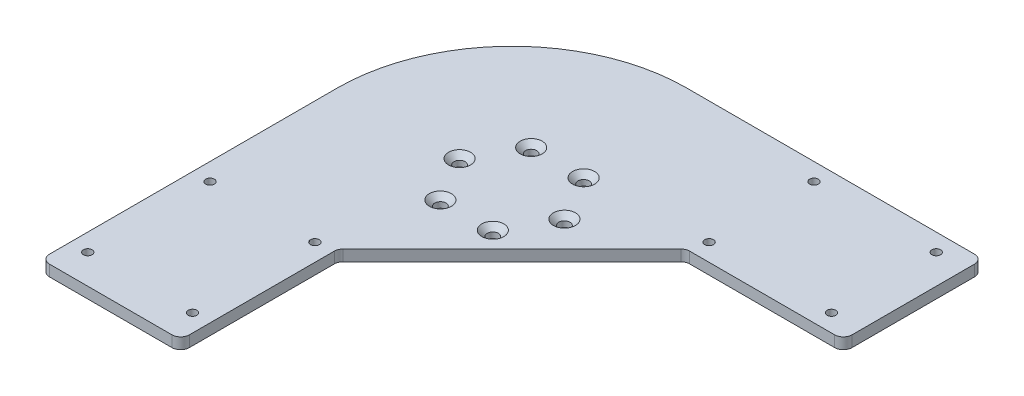
ISO-10303-21;
HEADER;
FILE_DESCRIPTION(('STEP AP214'),'2;1');
FILE_NAME('part.step','',(''),(''),'','','');
FILE_SCHEMA(('AUTOMOTIVE_DESIGN { 1 0 10303 214 1 1 1 1 }'));
ENDSEC;
DATA;
#1=APPLICATION_CONTEXT('core data for automotive mechanical design processes');
#2=APPLICATION_PROTOCOL_DEFINITION('international standard','automotive_design',2000,#1);
#3=PRODUCT_CONTEXT('',#1,'mechanical');
#4=PRODUCT('Part','Part','',(#3));
#5=PRODUCT_RELATED_PRODUCT_CATEGORY('part','',(#4));
#6=PRODUCT_DEFINITION_FORMATION('','',#4);
#7=PRODUCT_DEFINITION_CONTEXT('part definition',#1,'design');
#8=PRODUCT_DEFINITION('design','',#6,#7);
#9=PRODUCT_DEFINITION_SHAPE('','',#8);
#10=(LENGTH_UNIT() NAMED_UNIT(*) SI_UNIT(.MILLI.,.METRE.));
#11=(NAMED_UNIT(*) PLANE_ANGLE_UNIT() SI_UNIT($,.RADIAN.));
#12=(NAMED_UNIT(*) SI_UNIT($,.STERADIAN.) SOLID_ANGLE_UNIT());
#13=UNCERTAINTY_MEASURE_WITH_UNIT(LENGTH_MEASURE(1.E-05),#10,'distance_accuracy_value','');
#14=(GEOMETRIC_REPRESENTATION_CONTEXT(3) GLOBAL_UNCERTAINTY_ASSIGNED_CONTEXT((#13)) GLOBAL_UNIT_ASSIGNED_CONTEXT((#10,
#11,#12)) REPRESENTATION_CONTEXT('',''));
#15=CARTESIAN_POINT('',(0.,0.,0.));
#16=DIRECTION('',(0.,0.,1.));
#17=DIRECTION('',(1.,0.,0.));
#18=AXIS2_PLACEMENT_3D('',#15,#16,#17);
#19=CARTESIAN_POINT('',(169.625,-6.35,-100.));
#20=DIRECTION('',(1.,0.,0.));
#21=DIRECTION('',(0.,0.,-1.));
#22=AXIS2_PLACEMENT_3D('',#19,#20,#21);
#23=PLANE('',#22);
#24=DIRECTION('',(0.,0.,-1.));
#25=VECTOR('',#24,1.);
#26=CARTESIAN_POINT('',(169.625,-6.35,-100.));
#27=LINE('',#26,#25);
#28=CARTESIAN_POINT('',(169.625,-6.35,-25.));
#29=VERTEX_POINT('',#28);
#30=CARTESIAN_POINT('',(169.625,-6.35,-95.));
#31=VERTEX_POINT('',#30);
#32=EDGE_CURVE('E154',#29,#31,#27,.T.);
#33=ORIENTED_EDGE('',*,*,#32,.T.);
#34=DIRECTION('',(0.,1.,0.));
#35=VECTOR('',#34,1.);
#36=CARTESIAN_POINT('',(169.625,-6.35,-95.));
#37=LINE('',#36,#35);
#38=CARTESIAN_POINT('',(169.625,0.,-95.));
#39=VERTEX_POINT('',#38);
#40=EDGE_CURVE('E222',#31,#39,#37,.T.);
#41=ORIENTED_EDGE('',*,*,#40,.T.);
#42=DIRECTION('',(0.,0.,-1.));
#43=VECTOR('',#42,1.);
#44=CARTESIAN_POINT('',(169.625,0.,-100.));
#45=LINE('',#44,#43);
#46=CARTESIAN_POINT('',(169.625,0.,-25.));
#47=VERTEX_POINT('',#46);
#48=EDGE_CURVE('E187',#47,#39,#45,.T.);
#49=ORIENTED_EDGE('',*,*,#48,.F.);
#50=DIRECTION('',(0.,1.,0.));
#51=VECTOR('',#50,1.);
#52=CARTESIAN_POINT('',(169.625,-6.35,-25.));
#53=LINE('',#52,#51);
#54=EDGE_CURVE('E218',#47,#29,#53,.F.);
#55=ORIENTED_EDGE('',*,*,#54,.T.);
#56=EDGE_LOOP('',(#33,#41,#49,#55));
#57=FACE_BOUND('',#56,.T.);
#58=ADVANCED_FACE('F39',(#57),#23,.T.);
#59=CARTESIAN_POINT('',(169.625,-6.35,-20.));
#60=DIRECTION('',(0.,0.,1.));
#61=DIRECTION('',(1.,0.,0.));
#62=AXIS2_PLACEMENT_3D('',#59,#60,#61);
#63=PLANE('',#62);
#64=DIRECTION('',(1.,0.,0.));
#65=VECTOR('',#64,1.);
#66=CARTESIAN_POINT('',(169.625,-6.35,-20.));
#67=LINE('',#66,#65);
#68=CARTESIAN_POINT('',(81.6960678118655,-6.35,-20.));
#69=VERTEX_POINT('',#68);
#70=CARTESIAN_POINT('',(164.625,-6.35,-20.));
#71=VERTEX_POINT('',#70);
#72=EDGE_CURVE('E163',#69,#71,#67,.T.);
#73=ORIENTED_EDGE('',*,*,#72,.T.);
#74=DIRECTION('',(0.,1.,0.));
#75=VECTOR('',#74,1.);
#76=CARTESIAN_POINT('',(164.625,-6.35,-20.));
#77=LINE('',#76,#75);
#78=CARTESIAN_POINT('',(164.625,0.,-20.));
#79=VERTEX_POINT('',#78);
#80=EDGE_CURVE('E253',#71,#79,#77,.T.);
#81=ORIENTED_EDGE('',*,*,#80,.T.);
#82=DIRECTION('',(1.,0.,0.));
#83=VECTOR('',#82,1.);
#84=CARTESIAN_POINT('',(169.625,0.,-20.));
#85=LINE('',#84,#83);
#86=CARTESIAN_POINT('',(81.6960678118655,0.,-20.));
#87=VERTEX_POINT('',#86);
#88=EDGE_CURVE('E213',#87,#79,#85,.T.);
#89=ORIENTED_EDGE('',*,*,#88,.F.);
#90=DIRECTION('',(0.,1.,0.));
#91=VECTOR('',#90,1.);
#92=CARTESIAN_POINT('',(81.6960678118655,-6.35,-20.));
#93=LINE('',#92,#91);
#94=EDGE_CURVE('E250',#87,#69,#93,.F.);
#95=ORIENTED_EDGE('',*,*,#94,.T.);
#96=EDGE_LOOP('',(#73,#81,#89,#95));
#97=FACE_BOUND('',#96,.T.);
#98=ADVANCED_FACE('F509',(#97),#63,.T.);
#99=CARTESIAN_POINT('',(-20.,-6.35,79.625));
#100=DIRECTION('',(0.707106781186547,0.,0.707106781186548));
#101=DIRECTION('',(0.707106781186548,0.,-0.707106781186547));
#102=AXIS2_PLACEMENT_3D('',#99,#100,#101);
#103=PLANE('',#102);
#104=DIRECTION('',(0.707106781186548,0.,-0.707106781186548));
#105=VECTOR('',#104,1.);
#106=CARTESIAN_POINT('',(-20.,-6.35,79.625));
#107=LINE('',#106,#105);
#108=CARTESIAN_POINT('',(-18.5355339059327,-6.35,78.1605339059328));
#109=VERTEX_POINT('',#108);
#110=CARTESIAN_POINT('',(78.1605339059328,-6.35,-18.5355339059327));
#111=VERTEX_POINT('',#110);
#112=EDGE_CURVE('E180',#109,#111,#107,.T.);
#113=ORIENTED_EDGE('',*,*,#112,.T.);
#114=DIRECTION('',(0.,1.,0.));
#115=VECTOR('',#114,1.);
#116=CARTESIAN_POINT('',(78.1605339059328,0.,-18.5355339059327));
#117=LINE('',#116,#115);
#118=CARTESIAN_POINT('',(78.1605339059328,0.,-18.5355339059327));
#119=VERTEX_POINT('',#118);
#120=EDGE_CURVE('E260',#111,#119,#117,.T.);
#121=ORIENTED_EDGE('',*,*,#120,.T.);
#122=DIRECTION('',(0.707106781186548,0.,-0.707106781186548));
#123=VECTOR('',#122,1.);
#124=CARTESIAN_POINT('',(-20.,0.,79.625));
#125=LINE('',#124,#123);
#126=CARTESIAN_POINT('',(-18.5355339059327,0.,78.1605339059328));
#127=VERTEX_POINT('',#126);
#128=EDGE_CURVE('E209',#127,#119,#125,.T.);
#129=ORIENTED_EDGE('',*,*,#128,.F.);
#130=DIRECTION('',(0.,1.,0.));
#131=VECTOR('',#130,1.);
#132=CARTESIAN_POINT('',(-18.5355339059327,-6.35,78.1605339059328));
#133=LINE('',#132,#131);
#134=EDGE_CURVE('E257',#127,#109,#133,.F.);
#135=ORIENTED_EDGE('',*,*,#134,.T.);
#136=EDGE_LOOP('',(#113,#121,#129,#135));
#137=FACE_BOUND('',#136,.T.);
#138=ADVANCED_FACE('F296',(#137),#103,.T.);
#139=CARTESIAN_POINT('',(-20.,-6.35,79.625));
#140=DIRECTION('',(1.,0.,0.));
#141=DIRECTION('',(0.,0.,-1.));
#142=AXIS2_PLACEMENT_3D('',#139,#140,#141);
#143=PLANE('',#142);
#144=DIRECTION('',(0.,0.,-1.));
#145=VECTOR('',#144,1.);
#146=CARTESIAN_POINT('',(-20.,-6.35,79.625));
#147=LINE('',#146,#145);
#148=CARTESIAN_POINT('',(-20.,-6.35,164.625));
#149=VERTEX_POINT('',#148);
#150=CARTESIAN_POINT('',(-20.,-6.35,81.6960678118655));
#151=VERTEX_POINT('',#150);
#152=EDGE_CURVE('E176',#149,#151,#147,.T.);
#153=ORIENTED_EDGE('',*,*,#152,.T.);
#154=DIRECTION('',(0.,1.,0.));
#155=VECTOR('',#154,1.);
#156=CARTESIAN_POINT('',(-20.,0.,81.6960678118655));
#157=LINE('',#156,#155);
#158=CARTESIAN_POINT('',(-20.,0.,81.6960678118655));
#159=VERTEX_POINT('',#158);
#160=EDGE_CURVE('E267',#151,#159,#157,.T.);
#161=ORIENTED_EDGE('',*,*,#160,.T.);
#162=DIRECTION('',(0.,0.,-1.));
#163=VECTOR('',#162,1.);
#164=CARTESIAN_POINT('',(-20.,0.,79.625));
#165=LINE('',#164,#163);
#166=CARTESIAN_POINT('',(-20.,0.,164.625));
#167=VERTEX_POINT('',#166);
#168=EDGE_CURVE('E205',#167,#159,#165,.T.);
#169=ORIENTED_EDGE('',*,*,#168,.F.);
#170=DIRECTION('',(0.,1.,0.));
#171=VECTOR('',#170,1.);
#172=CARTESIAN_POINT('',(-20.,-6.35,164.625));
#173=LINE('',#172,#171);
#174=EDGE_CURVE('E264',#167,#149,#173,.F.);
#175=ORIENTED_EDGE('',*,*,#174,.T.);
#176=EDGE_LOOP('',(#153,#161,#169,#175));
#177=FACE_BOUND('',#176,.T.);
#178=ADVANCED_FACE('F302',(#177),#143,.T.);
#179=CARTESIAN_POINT('',(-20.,-6.35,169.625));
#180=DIRECTION('',(0.,0.,1.));
#181=DIRECTION('',(1.,0.,0.));
#182=AXIS2_PLACEMENT_3D('',#179,#180,#181);
#183=PLANE('',#182);
#184=DIRECTION('',(1.,0.,0.));
#185=VECTOR('',#184,1.);
#186=CARTESIAN_POINT('',(-20.,0.,169.625));
#187=LINE('',#186,#185);
#188=CARTESIAN_POINT('',(-95.,0.,169.625));
#189=VERTEX_POINT('',#188);
#190=CARTESIAN_POINT('',(-25.,0.,169.625));
#191=VERTEX_POINT('',#190);
#192=EDGE_CURVE('E201',#189,#191,#187,.T.);
#193=ORIENTED_EDGE('',*,*,#192,.F.);
#194=DIRECTION('',(0.,1.,0.));
#195=VECTOR('',#194,1.);
#196=CARTESIAN_POINT('',(-95.,-6.35,169.625));
#197=LINE('',#196,#195);
#198=CARTESIAN_POINT('',(-95.,-6.35,169.625));
#199=VERTEX_POINT('',#198);
#200=EDGE_CURVE('E279',#189,#199,#197,.F.);
#201=ORIENTED_EDGE('',*,*,#200,.T.);
#202=DIRECTION('',(1.,0.,0.));
#203=VECTOR('',#202,1.);
#204=CARTESIAN_POINT('',(-20.,-6.35,169.625));
#205=LINE('',#204,#203);
#206=CARTESIAN_POINT('',(-25.,-6.35,169.625));
#207=VERTEX_POINT('',#206);
#208=EDGE_CURVE('E170',#199,#207,#205,.T.);
#209=ORIENTED_EDGE('',*,*,#208,.T.);
#210=DIRECTION('',(0.,1.,0.));
#211=VECTOR('',#210,1.);
#212=CARTESIAN_POINT('',(-25.,-6.35,169.625));
#213=LINE('',#212,#211);
#214=EDGE_CURVE('E275',#207,#191,#213,.T.);
#215=ORIENTED_EDGE('',*,*,#214,.T.);
#216=EDGE_LOOP('',(#193,#201,#209,#215));
#217=FACE_BOUND('',#216,.T.);
#218=ADVANCED_FACE('F308',(#217),#183,.T.);
#219=CARTESIAN_POINT('',(-100.,-6.35,169.625));
#220=DIRECTION('',(-1.,0.,0.));
#221=DIRECTION('',(0.,0.,1.));
#222=AXIS2_PLACEMENT_3D('',#219,#220,#221);
#223=PLANE('',#222);
#224=DIRECTION('',(0.,0.,1.));
#225=VECTOR('',#224,1.);
#226=CARTESIAN_POINT('',(-100.,-6.35,169.625));
#227=LINE('',#226,#225);
#228=CARTESIAN_POINT('',(-100.,-6.35,0.));
#229=VERTEX_POINT('',#228);
#230=CARTESIAN_POINT('',(-100.,-6.35,164.625));
#231=VERTEX_POINT('',#230);
#232=EDGE_CURVE('E166',#229,#231,#227,.T.);
#233=ORIENTED_EDGE('',*,*,#232,.T.);
#234=DIRECTION('',(0.,1.,0.));
#235=VECTOR('',#234,1.);
#236=CARTESIAN_POINT('',(-100.,-6.35,164.625));
#237=LINE('',#236,#235);
#238=CARTESIAN_POINT('',(-100.,0.,164.625));
#239=VERTEX_POINT('',#238);
#240=EDGE_CURVE('E271',#231,#239,#237,.T.);
#241=ORIENTED_EDGE('',*,*,#240,.T.);
#242=DIRECTION('',(0.,0.,1.));
#243=VECTOR('',#242,1.);
#244=CARTESIAN_POINT('',(-100.,0.,169.625));
#245=LINE('',#244,#243);
#246=CARTESIAN_POINT('',(-100.,0.,0.));
#247=VERTEX_POINT('',#246);
#248=EDGE_CURVE('E197',#247,#239,#245,.T.);
#249=ORIENTED_EDGE('',*,*,#248,.F.);
#250=DIRECTION('',(0.,1.,0.));
#251=VECTOR('',#250,1.);
#252=CARTESIAN_POINT('',(-100.,-6.35,0.));
#253=LINE('',#252,#251);
#254=EDGE_CURVE('E162',#229,#247,#253,.T.);
#255=ORIENTED_EDGE('',*,*,#254,.F.);
#256=EDGE_LOOP('',(#233,#241,#249,#255));
#257=FACE_BOUND('',#256,.T.);
#258=ADVANCED_FACE('F315',(#257),#223,.T.);
#259=CARTESIAN_POINT('',(0.,-6.35,0.));
#260=DIRECTION('',(0.,1.,0.));
#261=DIRECTION('',(0.,0.,1.));
#262=AXIS2_PLACEMENT_3D('',#259,#260,#261);
#263=CYLINDRICAL_SURFACE('',#262,100.);
#264=CARTESIAN_POINT('',(0.,0.,0.));
#265=DIRECTION('',(0.,1.,0.));
#266=DIRECTION('',(0.,0.,1.));
#267=AXIS2_PLACEMENT_3D('',#264,#265,#266);
#268=CIRCLE('',#267,100.);
#269=CARTESIAN_POINT('',(0.,0.,-100.));
#270=VERTEX_POINT('',#269);
#271=EDGE_CURVE('E160',#270,#247,#268,.T.);
#272=ORIENTED_EDGE('',*,*,#271,.F.);
#273=DIRECTION('',(0.,1.,0.));
#274=VECTOR('',#273,1.);
#275=CARTESIAN_POINT('',(0.,-6.35,-100.));
#276=LINE('',#275,#274);
#277=CARTESIAN_POINT('',(0.,-6.35,-100.));
#278=VERTEX_POINT('',#277);
#279=EDGE_CURVE('E146',#278,#270,#276,.T.);
#280=ORIENTED_EDGE('',*,*,#279,.F.);
#281=CARTESIAN_POINT('',(0.,-6.35,0.));
#282=DIRECTION('',(0.,1.,0.));
#283=DIRECTION('',(0.,0.,1.));
#284=AXIS2_PLACEMENT_3D('',#281,#282,#283);
#285=CIRCLE('',#284,100.);
#286=EDGE_CURVE('E153',#278,#229,#285,.T.);
#287=ORIENTED_EDGE('',*,*,#286,.T.);
#288=ORIENTED_EDGE('',*,*,#254,.T.);
#289=EDGE_LOOP('',(#272,#280,#287,#288));
#290=FACE_BOUND('',#289,.T.);
#291=ADVANCED_FACE('F158',(#290),#263,.T.);
#292=CARTESIAN_POINT('',(0.,-6.35,-100.));
#293=DIRECTION('',(0.,0.,-1.));
#294=DIRECTION('',(-1.,0.,0.));
#295=AXIS2_PLACEMENT_3D('',#292,#293,#294);
#296=PLANE('',#295);
#297=DIRECTION('',(-1.,0.,0.));
#298=VECTOR('',#297,1.);
#299=CARTESIAN_POINT('',(0.,0.,-100.));
#300=LINE('',#299,#298);
#301=CARTESIAN_POINT('',(164.625,0.,-100.));
#302=VERTEX_POINT('',#301);
#303=EDGE_CURVE('E191',#302,#270,#300,.T.);
#304=ORIENTED_EDGE('',*,*,#303,.F.);
#305=DIRECTION('',(0.,1.,0.));
#306=VECTOR('',#305,1.);
#307=CARTESIAN_POINT('',(164.625,-6.35,-100.));
#308=LINE('',#307,#306);
#309=CARTESIAN_POINT('',(164.625,-6.35,-100.));
#310=VERTEX_POINT('',#309);
#311=EDGE_CURVE('E149',#302,#310,#308,.F.);
#312=ORIENTED_EDGE('',*,*,#311,.T.);
#313=DIRECTION('',(-1.,0.,0.));
#314=VECTOR('',#313,1.);
#315=CARTESIAN_POINT('',(0.,-6.35,-100.));
#316=LINE('',#315,#314);
#317=EDGE_CURVE('E142',#310,#278,#316,.T.);
#318=ORIENTED_EDGE('',*,*,#317,.T.);
#319=ORIENTED_EDGE('',*,*,#279,.T.);
#320=EDGE_LOOP('',(#304,#312,#318,#319));
#321=FACE_BOUND('',#320,.T.);
#322=ADVANCED_FACE('F145',(#321),#296,.T.);
#323=CARTESIAN_POINT('',(0.,-6.35,0.));
#324=DIRECTION('',(0.,1.,0.));
#325=DIRECTION('',(0.,0.,1.));
#326=AXIS2_PLACEMENT_3D('',#323,#324,#325);
#327=PLANE('',#326);
#328=CARTESIAN_POINT('',(15.,-6.35,-25.9807621135332));
#329=DIRECTION('',(0.,1.,0.));
#330=DIRECTION('',(0.,0.,1.));
#331=AXIS2_PLACEMENT_3D('',#328,#329,#330);
#332=CIRCLE('',#331,3.2);
#333=CARTESIAN_POINT('',(15.,-6.35,-22.7807621135332));
#334=VERTEX_POINT('',#333);
#335=EDGE_CURVE('E450',#334,#334,#332,.T.);
#336=ORIENTED_EDGE('',*,*,#335,.T.);
#337=EDGE_LOOP('',(#336));
#338=FACE_BOUND('',#337,.T.);
#339=CARTESIAN_POINT('',(30.,-6.35,0.));
#340=DIRECTION('',(0.,1.,0.));
#341=DIRECTION('',(0.,0.,1.));
#342=AXIS2_PLACEMENT_3D('',#339,#340,#341);
#343=CIRCLE('',#342,3.2);
#344=CARTESIAN_POINT('',(30.,-6.35,3.19999999999999));
#345=VERTEX_POINT('',#344);
#346=EDGE_CURVE('E438',#345,#345,#343,.T.);
#347=ORIENTED_EDGE('',*,*,#346,.T.);
#348=EDGE_LOOP('',(#347));
#349=FACE_BOUND('',#348,.T.);
#350=CARTESIAN_POINT('',(15.,-6.35,25.9807621135332));
#351=DIRECTION('',(0.,1.,0.));
#352=DIRECTION('',(0.,0.,1.));
#353=AXIS2_PLACEMENT_3D('',#350,#351,#352);
#354=CIRCLE('',#353,3.2);
#355=CARTESIAN_POINT('',(15.,-6.35,29.1807621135332));
#356=VERTEX_POINT('',#355);
#357=EDGE_CURVE('E426',#356,#356,#354,.T.);
#358=ORIENTED_EDGE('',*,*,#357,.T.);
#359=EDGE_LOOP('',(#358));
#360=FACE_BOUND('',#359,.T.);
#361=CARTESIAN_POINT('',(-15.,-6.35,25.9807621135332));
#362=DIRECTION('',(0.,1.,0.));
#363=DIRECTION('',(0.,0.,1.));
#364=AXIS2_PLACEMENT_3D('',#361,#362,#363);
#365=CIRCLE('',#364,3.2);
#366=CARTESIAN_POINT('',(-15.,-6.35,29.1807621135332));
#367=VERTEX_POINT('',#366);
#368=EDGE_CURVE('E414',#367,#367,#365,.T.);
#369=ORIENTED_EDGE('',*,*,#368,.T.);
#370=EDGE_LOOP('',(#369));
#371=FACE_BOUND('',#370,.T.);
#372=CARTESIAN_POINT('',(-30.,-6.35,0.));
#373=DIRECTION('',(0.,1.,0.));
#374=DIRECTION('',(0.,0.,1.));
#375=AXIS2_PLACEMENT_3D('',#372,#373,#374);
#376=CIRCLE('',#375,3.2);
#377=CARTESIAN_POINT('',(-30.,-6.35,3.2));
#378=VERTEX_POINT('',#377);
#379=EDGE_CURVE('E402',#378,#378,#376,.T.);
#380=ORIENTED_EDGE('',*,*,#379,.T.);
#381=EDGE_LOOP('',(#380));
#382=FACE_BOUND('',#381,.T.);
#383=CARTESIAN_POINT('',(-15.,-6.35,-25.9807621135332));
#384=DIRECTION('',(0.,1.,0.));
#385=DIRECTION('',(0.,0.,1.));
#386=AXIS2_PLACEMENT_3D('',#383,#384,#385);
#387=CIRCLE('',#386,3.2);
#388=CARTESIAN_POINT('',(-15.,-6.35,-22.7807621135332));
#389=VERTEX_POINT('',#388);
#390=EDGE_CURVE('E390',#389,#389,#387,.T.);
#391=ORIENTED_EDGE('',*,*,#390,.T.);
#392=EDGE_LOOP('',(#391));
#393=FACE_BOUND('',#392,.T.);
#394=CARTESIAN_POINT('',(82.8,-6.35,-90.));
#395=DIRECTION('',(0.,1.,0.));
#396=DIRECTION('',(0.,0.,1.));
#397=AXIS2_PLACEMENT_3D('',#394,#395,#396);
#398=CIRCLE('',#397,2.5);
#399=CARTESIAN_POINT('',(82.8,-6.35,-87.5));
#400=VERTEX_POINT('',#399);
#401=EDGE_CURVE('E382',#400,#400,#398,.T.);
#402=ORIENTED_EDGE('',*,*,#401,.T.);
#403=EDGE_LOOP('',(#402));
#404=FACE_BOUND('',#403,.T.);
#405=CARTESIAN_POINT('',(152.8,-6.35,-90.));
#406=DIRECTION('',(0.,1.,0.));
#407=DIRECTION('',(0.,0.,1.));
#408=AXIS2_PLACEMENT_3D('',#405,#406,#407);
#409=CIRCLE('',#408,2.5);
#410=CARTESIAN_POINT('',(152.8,-6.35,-87.5));
#411=VERTEX_POINT('',#410);
#412=EDGE_CURVE('E374',#411,#411,#409,.T.);
#413=ORIENTED_EDGE('',*,*,#412,.T.);
#414=EDGE_LOOP('',(#413));
#415=FACE_BOUND('',#414,.T.);
#416=CARTESIAN_POINT('',(152.8,-6.35,-30.));
#417=DIRECTION('',(0.,1.,0.));
#418=DIRECTION('',(0.,0.,1.));
#419=AXIS2_PLACEMENT_3D('',#416,#417,#418);
#420=CIRCLE('',#419,2.5);
#421=CARTESIAN_POINT('',(152.8,-6.35,-27.5));
#422=VERTEX_POINT('',#421);
#423=EDGE_CURVE('E366',#422,#422,#420,.T.);
#424=ORIENTED_EDGE('',*,*,#423,.T.);
#425=EDGE_LOOP('',(#424));
#426=FACE_BOUND('',#425,.T.);
#427=CARTESIAN_POINT('',(-90.,-6.35,82.8));
#428=DIRECTION('',(0.,1.,0.));
#429=DIRECTION('',(0.,0.,1.));
#430=AXIS2_PLACEMENT_3D('',#427,#428,#429);
#431=CIRCLE('',#430,2.5);
#432=CARTESIAN_POINT('',(-90.,-6.35,85.3));
#433=VERTEX_POINT('',#432);
#434=EDGE_CURVE('E358',#433,#433,#431,.T.);
#435=ORIENTED_EDGE('',*,*,#434,.T.);
#436=EDGE_LOOP('',(#435));
#437=FACE_BOUND('',#436,.T.);
#438=CARTESIAN_POINT('',(-30.,-6.35,82.8));
#439=DIRECTION('',(0.,1.,0.));
#440=DIRECTION('',(0.,0.,1.));
#441=AXIS2_PLACEMENT_3D('',#438,#439,#440);
#442=CIRCLE('',#441,2.5);
#443=CARTESIAN_POINT('',(-30.,-6.35,85.3));
#444=VERTEX_POINT('',#443);
#445=EDGE_CURVE('E350',#444,#444,#442,.T.);
#446=ORIENTED_EDGE('',*,*,#445,.T.);
#447=EDGE_LOOP('',(#446));
#448=FACE_BOUND('',#447,.T.);
#449=CARTESIAN_POINT('',(-30.,-6.35,152.8));
#450=DIRECTION('',(0.,1.,0.));
#451=DIRECTION('',(0.,0.,1.));
#452=AXIS2_PLACEMENT_3D('',#449,#450,#451);
#453=CIRCLE('',#452,2.5);
#454=CARTESIAN_POINT('',(-30.,-6.35,155.3));
#455=VERTEX_POINT('',#454);
#456=EDGE_CURVE('E342',#455,#455,#453,.T.);
#457=ORIENTED_EDGE('',*,*,#456,.T.);
#458=EDGE_LOOP('',(#457));
#459=FACE_BOUND('',#458,.T.);
#460=CARTESIAN_POINT('',(-90.,-6.35,152.8));
#461=DIRECTION('',(0.,1.,0.));
#462=DIRECTION('',(0.,0.,1.));
#463=AXIS2_PLACEMENT_3D('',#460,#461,#462);
#464=CIRCLE('',#463,2.5);
#465=CARTESIAN_POINT('',(-90.,-6.35,155.3));
#466=VERTEX_POINT('',#465);
#467=EDGE_CURVE('E334',#466,#466,#464,.T.);
#468=ORIENTED_EDGE('',*,*,#467,.T.);
#469=EDGE_LOOP('',(#468));
#470=FACE_BOUND('',#469,.T.);
#471=CARTESIAN_POINT('',(82.8,-6.35,-30.));
#472=DIRECTION('',(0.,1.,0.));
#473=DIRECTION('',(0.,0.,1.));
#474=AXIS2_PLACEMENT_3D('',#471,#472,#473);
#475=CIRCLE('',#474,2.5);
#476=CARTESIAN_POINT('',(82.8,-6.35,-27.5));
#477=VERTEX_POINT('',#476);
#478=EDGE_CURVE('E192',#477,#477,#475,.T.);
#479=ORIENTED_EDGE('',*,*,#478,.T.);
#480=EDGE_LOOP('',(#479));
#481=FACE_BOUND('',#480,.T.);
#482=ORIENTED_EDGE('',*,*,#317,.F.);
#483=CARTESIAN_POINT('',(164.625,-6.35,-95.));
#484=DIRECTION('',(0.,1.,0.));
#485=DIRECTION('',(0.,0.,1.));
#486=AXIS2_PLACEMENT_3D('',#483,#484,#485);
#487=CIRCLE('',#486,5.);
#488=EDGE_CURVE('E247',#310,#31,#487,.F.);
#489=ORIENTED_EDGE('',*,*,#488,.T.);
#490=ORIENTED_EDGE('',*,*,#32,.F.);
#491=CARTESIAN_POINT('',(164.625,-6.35,-25.));
#492=DIRECTION('',(0.,1.,0.));
#493=DIRECTION('',(0.,0.,1.));
#494=AXIS2_PLACEMENT_3D('',#491,#492,#493);
#495=CIRCLE('',#494,5.);
#496=EDGE_CURVE('E244',#29,#71,#495,.F.);
#497=ORIENTED_EDGE('',*,*,#496,.T.);
#498=ORIENTED_EDGE('',*,*,#72,.F.);
#499=CARTESIAN_POINT('',(81.6960678118655,-6.35,-14.9999999999999));
#500=DIRECTION('',(0.,1.,0.));
#501=DIRECTION('',(0.,0.,1.));
#502=AXIS2_PLACEMENT_3D('',#499,#500,#501);
#503=CIRCLE('',#502,5.);
#504=EDGE_CURVE('E285',#69,#111,#503,.T.);
#505=ORIENTED_EDGE('',*,*,#504,.T.);
#506=ORIENTED_EDGE('',*,*,#112,.F.);
#507=CARTESIAN_POINT('',(-15.,-6.35,81.6960678118655));
#508=DIRECTION('',(0.,1.,0.));
#509=DIRECTION('',(0.,0.,1.));
#510=AXIS2_PLACEMENT_3D('',#507,#508,#509);
#511=CIRCLE('',#510,5.);
#512=EDGE_CURVE('E11',#109,#151,#511,.T.);
#513=ORIENTED_EDGE('',*,*,#512,.T.);
#514=ORIENTED_EDGE('',*,*,#152,.F.);
#515=CARTESIAN_POINT('',(-25.,-6.35,164.625));
#516=DIRECTION('',(0.,1.,0.));
#517=DIRECTION('',(0.,0.,1.));
#518=AXIS2_PLACEMENT_3D('',#515,#516,#517);
#519=CIRCLE('',#518,5.);
#520=EDGE_CURVE('E61',#149,#207,#519,.F.);
#521=ORIENTED_EDGE('',*,*,#520,.T.);
#522=ORIENTED_EDGE('',*,*,#208,.F.);
#523=CARTESIAN_POINT('',(-95.,-6.35,164.625));
#524=DIRECTION('',(0.,1.,0.));
#525=DIRECTION('',(0.,0.,1.));
#526=AXIS2_PLACEMENT_3D('',#523,#524,#525);
#527=CIRCLE('',#526,5.);
#528=EDGE_CURVE('E55',#199,#231,#527,.F.);
#529=ORIENTED_EDGE('',*,*,#528,.T.);
#530=ORIENTED_EDGE('',*,*,#232,.F.);
#531=ORIENTED_EDGE('',*,*,#286,.F.);
#532=EDGE_LOOP('',(#482,#489,#490,#497,#498,#505,#506,#513,#514,#521,#522,#529,#530,#531));
#533=FACE_BOUND('',#532,.T.);
#534=ADVANCED_FACE('F165',(#338,#349,#360,#371,#382,#393,#404,#415,#426,#437,#448,#459,#470,
#481,#533),#327,.F.);
#535=CARTESIAN_POINT('',(0.,0.,0.));
#536=DIRECTION('',(0.,1.,0.));
#537=DIRECTION('',(0.,0.,1.));
#538=AXIS2_PLACEMENT_3D('',#535,#536,#537);
#539=PLANE('',#538);
#540=CARTESIAN_POINT('',(15.,0.,-25.9807621135332));
#541=DIRECTION('',(0.,1.,0.));
#542=DIRECTION('',(0.,0.,1.));
#543=AXIS2_PLACEMENT_3D('',#540,#541,#542);
#544=CIRCLE('',#543,6.3);
#545=CARTESIAN_POINT('',(15.,0.,-19.6807621135332));
#546=VERTEX_POINT('',#545);
#547=EDGE_CURVE('E458',#546,#546,#544,.T.);
#548=ORIENTED_EDGE('',*,*,#547,.F.);
#549=EDGE_LOOP('',(#548));
#550=FACE_BOUND('',#549,.T.);
#551=CARTESIAN_POINT('',(30.,0.,0.));
#552=DIRECTION('',(0.,1.,0.));
#553=DIRECTION('',(0.,0.,1.));
#554=AXIS2_PLACEMENT_3D('',#551,#552,#553);
#555=CIRCLE('',#554,6.3);
#556=CARTESIAN_POINT('',(30.,0.,6.29999999999999));
#557=VERTEX_POINT('',#556);
#558=EDGE_CURVE('E446',#557,#557,#555,.T.);
#559=ORIENTED_EDGE('',*,*,#558,.F.);
#560=EDGE_LOOP('',(#559));
#561=FACE_BOUND('',#560,.T.);
#562=CARTESIAN_POINT('',(15.,0.,25.9807621135332));
#563=DIRECTION('',(0.,1.,0.));
#564=DIRECTION('',(0.,0.,1.));
#565=AXIS2_PLACEMENT_3D('',#562,#563,#564);
#566=CIRCLE('',#565,6.3);
#567=CARTESIAN_POINT('',(15.,0.,32.2807621135332));
#568=VERTEX_POINT('',#567);
#569=EDGE_CURVE('E434',#568,#568,#566,.T.);
#570=ORIENTED_EDGE('',*,*,#569,.F.);
#571=EDGE_LOOP('',(#570));
#572=FACE_BOUND('',#571,.T.);
#573=CARTESIAN_POINT('',(-15.,0.,25.9807621135332));
#574=DIRECTION('',(0.,1.,0.));
#575=DIRECTION('',(0.,0.,1.));
#576=AXIS2_PLACEMENT_3D('',#573,#574,#575);
#577=CIRCLE('',#576,6.3);
#578=CARTESIAN_POINT('',(-15.,0.,32.2807621135332));
#579=VERTEX_POINT('',#578);
#580=EDGE_CURVE('E422',#579,#579,#577,.T.);
#581=ORIENTED_EDGE('',*,*,#580,.F.);
#582=EDGE_LOOP('',(#581));
#583=FACE_BOUND('',#582,.T.);
#584=CARTESIAN_POINT('',(-30.,0.,0.));
#585=DIRECTION('',(0.,1.,0.));
#586=DIRECTION('',(0.,0.,1.));
#587=AXIS2_PLACEMENT_3D('',#584,#585,#586);
#588=CIRCLE('',#587,6.3);
#589=CARTESIAN_POINT('',(-30.,0.,6.3));
#590=VERTEX_POINT('',#589);
#591=EDGE_CURVE('E410',#590,#590,#588,.T.);
#592=ORIENTED_EDGE('',*,*,#591,.F.);
#593=EDGE_LOOP('',(#592));
#594=FACE_BOUND('',#593,.T.);
#595=CARTESIAN_POINT('',(-15.,0.,-25.9807621135332));
#596=DIRECTION('',(0.,1.,0.));
#597=DIRECTION('',(0.,0.,1.));
#598=AXIS2_PLACEMENT_3D('',#595,#596,#597);
#599=CIRCLE('',#598,6.3);
#600=CARTESIAN_POINT('',(-15.,0.,-19.6807621135332));
#601=VERTEX_POINT('',#600);
#602=EDGE_CURVE('E398',#601,#601,#599,.T.);
#603=ORIENTED_EDGE('',*,*,#602,.F.);
#604=EDGE_LOOP('',(#603));
#605=FACE_BOUND('',#604,.T.);
#606=CARTESIAN_POINT('',(82.8,0.,-90.));
#607=DIRECTION('',(0.,1.,0.));
#608=DIRECTION('',(0.,0.,1.));
#609=AXIS2_PLACEMENT_3D('',#606,#607,#608);
#610=CIRCLE('',#609,2.5);
#611=CARTESIAN_POINT('',(82.8,0.,-87.5));
#612=VERTEX_POINT('',#611);
#613=EDGE_CURVE('E386',#612,#612,#610,.T.);
#614=ORIENTED_EDGE('',*,*,#613,.F.);
#615=EDGE_LOOP('',(#614));
#616=FACE_BOUND('',#615,.T.);
#617=CARTESIAN_POINT('',(152.8,0.,-90.));
#618=DIRECTION('',(0.,1.,0.));
#619=DIRECTION('',(0.,0.,1.));
#620=AXIS2_PLACEMENT_3D('',#617,#618,#619);
#621=CIRCLE('',#620,2.5);
#622=CARTESIAN_POINT('',(152.8,0.,-87.5));
#623=VERTEX_POINT('',#622);
#624=EDGE_CURVE('E378',#623,#623,#621,.T.);
#625=ORIENTED_EDGE('',*,*,#624,.F.);
#626=EDGE_LOOP('',(#625));
#627=FACE_BOUND('',#626,.T.);
#628=CARTESIAN_POINT('',(152.8,0.,-30.));
#629=DIRECTION('',(0.,1.,0.));
#630=DIRECTION('',(0.,0.,1.));
#631=AXIS2_PLACEMENT_3D('',#628,#629,#630);
#632=CIRCLE('',#631,2.5);
#633=CARTESIAN_POINT('',(152.8,0.,-27.5));
#634=VERTEX_POINT('',#633);
#635=EDGE_CURVE('E370',#634,#634,#632,.T.);
#636=ORIENTED_EDGE('',*,*,#635,.F.);
#637=EDGE_LOOP('',(#636));
#638=FACE_BOUND('',#637,.T.);
#639=CARTESIAN_POINT('',(-90.,0.,82.8));
#640=DIRECTION('',(0.,1.,0.));
#641=DIRECTION('',(0.,0.,1.));
#642=AXIS2_PLACEMENT_3D('',#639,#640,#641);
#643=CIRCLE('',#642,2.5);
#644=CARTESIAN_POINT('',(-90.,0.,85.3));
#645=VERTEX_POINT('',#644);
#646=EDGE_CURVE('E362',#645,#645,#643,.T.);
#647=ORIENTED_EDGE('',*,*,#646,.F.);
#648=EDGE_LOOP('',(#647));
#649=FACE_BOUND('',#648,.T.);
#650=CARTESIAN_POINT('',(-30.,0.,82.8));
#651=DIRECTION('',(0.,1.,0.));
#652=DIRECTION('',(0.,0.,1.));
#653=AXIS2_PLACEMENT_3D('',#650,#651,#652);
#654=CIRCLE('',#653,2.5);
#655=CARTESIAN_POINT('',(-30.,0.,85.3));
#656=VERTEX_POINT('',#655);
#657=EDGE_CURVE('E354',#656,#656,#654,.T.);
#658=ORIENTED_EDGE('',*,*,#657,.F.);
#659=EDGE_LOOP('',(#658));
#660=FACE_BOUND('',#659,.T.);
#661=CARTESIAN_POINT('',(-30.,0.,152.8));
#662=DIRECTION('',(0.,1.,0.));
#663=DIRECTION('',(0.,0.,1.));
#664=AXIS2_PLACEMENT_3D('',#661,#662,#663);
#665=CIRCLE('',#664,2.5);
#666=CARTESIAN_POINT('',(-30.,0.,155.3));
#667=VERTEX_POINT('',#666);
#668=EDGE_CURVE('E346',#667,#667,#665,.T.);
#669=ORIENTED_EDGE('',*,*,#668,.F.);
#670=EDGE_LOOP('',(#669));
#671=FACE_BOUND('',#670,.T.);
#672=CARTESIAN_POINT('',(-90.,0.,152.8));
#673=DIRECTION('',(0.,1.,0.));
#674=DIRECTION('',(0.,0.,1.));
#675=AXIS2_PLACEMENT_3D('',#672,#673,#674);
#676=CIRCLE('',#675,2.5);
#677=CARTESIAN_POINT('',(-90.,0.,155.3));
#678=VERTEX_POINT('',#677);
#679=EDGE_CURVE('E338',#678,#678,#676,.T.);
#680=ORIENTED_EDGE('',*,*,#679,.F.);
#681=EDGE_LOOP('',(#680));
#682=FACE_BOUND('',#681,.T.);
#683=CARTESIAN_POINT('',(82.8,0.,-30.));
#684=DIRECTION('',(0.,1.,0.));
#685=DIRECTION('',(0.,0.,1.));
#686=AXIS2_PLACEMENT_3D('',#683,#684,#685);
#687=CIRCLE('',#686,2.5);
#688=CARTESIAN_POINT('',(82.8,0.,-27.5));
#689=VERTEX_POINT('',#688);
#690=EDGE_CURVE('E330',#689,#689,#687,.T.);
#691=ORIENTED_EDGE('',*,*,#690,.F.);
#692=EDGE_LOOP('',(#691));
#693=FACE_BOUND('',#692,.T.);
#694=ORIENTED_EDGE('',*,*,#48,.T.);
#695=CARTESIAN_POINT('',(164.625,0.,-95.));
#696=DIRECTION('',(0.,1.,0.));
#697=DIRECTION('',(0.,0.,1.));
#698=AXIS2_PLACEMENT_3D('',#695,#696,#697);
#699=CIRCLE('',#698,5.);
#700=EDGE_CURVE('E235',#39,#302,#699,.T.);
#701=ORIENTED_EDGE('',*,*,#700,.T.);
#702=ORIENTED_EDGE('',*,*,#303,.T.);
#703=ORIENTED_EDGE('',*,*,#271,.T.);
#704=ORIENTED_EDGE('',*,*,#248,.T.);
#705=CARTESIAN_POINT('',(-95.,0.,164.625));
#706=DIRECTION('',(0.,1.,0.));
#707=DIRECTION('',(0.,0.,1.));
#708=AXIS2_PLACEMENT_3D('',#705,#706,#707);
#709=CIRCLE('',#708,5.);
#710=EDGE_CURVE('E229',#239,#189,#709,.T.);
#711=ORIENTED_EDGE('',*,*,#710,.T.);
#712=ORIENTED_EDGE('',*,*,#192,.T.);
#713=CARTESIAN_POINT('',(-25.,0.,164.625));
#714=DIRECTION('',(0.,1.,0.));
#715=DIRECTION('',(0.,0.,1.));
#716=AXIS2_PLACEMENT_3D('',#713,#714,#715);
#717=CIRCLE('',#716,5.);
#718=EDGE_CURVE('E226',#191,#167,#717,.T.);
#719=ORIENTED_EDGE('',*,*,#718,.T.);
#720=ORIENTED_EDGE('',*,*,#168,.T.);
#721=CARTESIAN_POINT('',(-15.,0.,81.6960678118655));
#722=DIRECTION('',(0.,1.,0.));
#723=DIRECTION('',(0.,0.,1.));
#724=AXIS2_PLACEMENT_3D('',#721,#722,#723);
#725=CIRCLE('',#724,5.);
#726=EDGE_CURVE('E48',#159,#127,#725,.F.);
#727=ORIENTED_EDGE('',*,*,#726,.T.);
#728=ORIENTED_EDGE('',*,*,#128,.T.);
#729=CARTESIAN_POINT('',(81.6960678118655,0.,-14.9999999999999));
#730=DIRECTION('',(0.,1.,0.));
#731=DIRECTION('',(0.,0.,1.));
#732=AXIS2_PLACEMENT_3D('',#729,#730,#731);
#733=CIRCLE('',#732,5.);
#734=EDGE_CURVE('E282',#119,#87,#733,.F.);
#735=ORIENTED_EDGE('',*,*,#734,.T.);
#736=ORIENTED_EDGE('',*,*,#88,.T.);
#737=CARTESIAN_POINT('',(164.625,0.,-25.));
#738=DIRECTION('',(0.,1.,0.));
#739=DIRECTION('',(0.,0.,1.));
#740=AXIS2_PLACEMENT_3D('',#737,#738,#739);
#741=CIRCLE('',#740,5.);
#742=EDGE_CURVE('E232',#79,#47,#741,.T.);
#743=ORIENTED_EDGE('',*,*,#742,.T.);
#744=EDGE_LOOP('',(#694,#701,#702,#703,#704,#711,#712,#719,#720,#727,#728,#735,#736,#743));
#745=FACE_BOUND('',#744,.T.);
#746=ADVANCED_FACE('F290',(#550,#561,#572,#583,#594,#605,#616,#627,#638,#649,#660,#671,#682,
#693,#745),#539,.T.);
#747=CARTESIAN_POINT('',(164.625,-6.35,-95.));
#748=DIRECTION('',(0.,1.,0.));
#749=DIRECTION('',(0.,0.,1.));
#750=AXIS2_PLACEMENT_3D('',#747,#748,#749);
#751=CYLINDRICAL_SURFACE('',#750,5.);
#752=ORIENTED_EDGE('',*,*,#488,.F.);
#753=ORIENTED_EDGE('',*,*,#311,.F.);
#754=ORIENTED_EDGE('',*,*,#700,.F.);
#755=ORIENTED_EDGE('',*,*,#40,.F.);
#756=EDGE_LOOP('',(#752,#753,#754,#755));
#757=FACE_BOUND('',#756,.T.);
#758=ADVANCED_FACE('F317',(#757),#751,.T.);
#759=CARTESIAN_POINT('',(164.625,-6.35,-25.));
#760=DIRECTION('',(0.,1.,0.));
#761=DIRECTION('',(0.,0.,1.));
#762=AXIS2_PLACEMENT_3D('',#759,#760,#761);
#763=CYLINDRICAL_SURFACE('',#762,5.);
#764=ORIENTED_EDGE('',*,*,#496,.F.);
#765=ORIENTED_EDGE('',*,*,#54,.F.);
#766=ORIENTED_EDGE('',*,*,#742,.F.);
#767=ORIENTED_EDGE('',*,*,#80,.F.);
#768=EDGE_LOOP('',(#764,#765,#766,#767));
#769=FACE_BOUND('',#768,.T.);
#770=ADVANCED_FACE('F521',(#769),#763,.T.);
#771=CARTESIAN_POINT('',(81.6960678118655,-6.35,-14.9999999999999));
#772=DIRECTION('',(0.,-1.,0.));
#773=DIRECTION('',(0.,0.,-1.));
#774=AXIS2_PLACEMENT_3D('',#771,#772,#773);
#775=CYLINDRICAL_SURFACE('',#774,5.);
#776=ORIENTED_EDGE('',*,*,#504,.F.);
#777=ORIENTED_EDGE('',*,*,#94,.F.);
#778=ORIENTED_EDGE('',*,*,#734,.F.);
#779=ORIENTED_EDGE('',*,*,#120,.F.);
#780=EDGE_LOOP('',(#776,#777,#778,#779));
#781=FACE_BOUND('',#780,.T.);
#782=ADVANCED_FACE('F524',(#781),#775,.F.);
#783=CARTESIAN_POINT('',(-15.,-6.35,81.6960678118655));
#784=DIRECTION('',(0.,-1.,0.));
#785=DIRECTION('',(0.,0.,-1.));
#786=AXIS2_PLACEMENT_3D('',#783,#784,#785);
#787=CYLINDRICAL_SURFACE('',#786,5.);
#788=ORIENTED_EDGE('',*,*,#512,.F.);
#789=ORIENTED_EDGE('',*,*,#134,.F.);
#790=ORIENTED_EDGE('',*,*,#726,.F.);
#791=ORIENTED_EDGE('',*,*,#160,.F.);
#792=EDGE_LOOP('',(#788,#789,#790,#791));
#793=FACE_BOUND('',#792,.T.);
#794=ADVANCED_FACE('F300',(#793),#787,.F.);
#795=CARTESIAN_POINT('',(-95.,-6.35,164.625));
#796=DIRECTION('',(0.,1.,0.));
#797=DIRECTION('',(0.,0.,1.));
#798=AXIS2_PLACEMENT_3D('',#795,#796,#797);
#799=CYLINDRICAL_SURFACE('',#798,5.);
#800=ORIENTED_EDGE('',*,*,#528,.F.);
#801=ORIENTED_EDGE('',*,*,#200,.F.);
#802=ORIENTED_EDGE('',*,*,#710,.F.);
#803=ORIENTED_EDGE('',*,*,#240,.F.);
#804=EDGE_LOOP('',(#800,#801,#802,#803));
#805=FACE_BOUND('',#804,.T.);
#806=ADVANCED_FACE('F313',(#805),#799,.T.);
#807=CARTESIAN_POINT('',(-25.,-6.35,164.625));
#808=DIRECTION('',(0.,1.,0.));
#809=DIRECTION('',(0.,0.,1.));
#810=AXIS2_PLACEMENT_3D('',#807,#808,#809);
#811=CYLINDRICAL_SURFACE('',#810,5.);
#812=ORIENTED_EDGE('',*,*,#520,.F.);
#813=ORIENTED_EDGE('',*,*,#174,.F.);
#814=ORIENTED_EDGE('',*,*,#718,.F.);
#815=ORIENTED_EDGE('',*,*,#214,.F.);
#816=EDGE_LOOP('',(#812,#813,#814,#815));
#817=FACE_BOUND('',#816,.T.);
#818=ADVANCED_FACE('F41',(#817),#811,.T.);
#819=CARTESIAN_POINT('',(82.8,0.,-30.));
#820=DIRECTION('',(0.,1.,0.));
#821=DIRECTION('',(0.,0.,1.));
#822=AXIS2_PLACEMENT_3D('',#819,#820,#821);
#823=CYLINDRICAL_SURFACE('',#822,2.5);
#824=ORIENTED_EDGE('',*,*,#478,.F.);
#825=EDGE_LOOP('',(#824));
#826=FACE_BOUND('',#825,.T.);
#827=ORIENTED_EDGE('',*,*,#690,.T.);
#828=EDGE_LOOP('',(#827));
#829=FACE_BOUND('',#828,.T.);
#830=ADVANCED_FACE('F494',(#826,#829),#823,.F.);
#831=CARTESIAN_POINT('',(-90.,0.,152.8));
#832=DIRECTION('',(0.,1.,0.));
#833=DIRECTION('',(0.,0.,1.));
#834=AXIS2_PLACEMENT_3D('',#831,#832,#833);
#835=CYLINDRICAL_SURFACE('',#834,2.5);
#836=ORIENTED_EDGE('',*,*,#467,.F.);
#837=EDGE_LOOP('',(#836));
#838=FACE_BOUND('',#837,.T.);
#839=ORIENTED_EDGE('',*,*,#679,.T.);
#840=EDGE_LOOP('',(#839));
#841=FACE_BOUND('',#840,.T.);
#842=ADVANCED_FACE('F496',(#838,#841),#835,.F.);
#843=CARTESIAN_POINT('',(-30.,0.,152.8));
#844=DIRECTION('',(0.,1.,0.));
#845=DIRECTION('',(0.,0.,1.));
#846=AXIS2_PLACEMENT_3D('',#843,#844,#845);
#847=CYLINDRICAL_SURFACE('',#846,2.5);
#848=ORIENTED_EDGE('',*,*,#456,.F.);
#849=EDGE_LOOP('',(#848));
#850=FACE_BOUND('',#849,.T.);
#851=ORIENTED_EDGE('',*,*,#668,.T.);
#852=EDGE_LOOP('',(#851));
#853=FACE_BOUND('',#852,.T.);
#854=ADVANCED_FACE('F503',(#850,#853),#847,.F.);
#855=CARTESIAN_POINT('',(-30.,0.,82.8));
#856=DIRECTION('',(0.,1.,0.));
#857=DIRECTION('',(0.,0.,1.));
#858=AXIS2_PLACEMENT_3D('',#855,#856,#857);
#859=CYLINDRICAL_SURFACE('',#858,2.5);
#860=ORIENTED_EDGE('',*,*,#445,.F.);
#861=EDGE_LOOP('',(#860));
#862=FACE_BOUND('',#861,.T.);
#863=ORIENTED_EDGE('',*,*,#657,.T.);
#864=EDGE_LOOP('',(#863));
#865=FACE_BOUND('',#864,.T.);
#866=ADVANCED_FACE('F558',(#862,#865),#859,.F.);
#867=CARTESIAN_POINT('',(-90.,0.,82.8));
#868=DIRECTION('',(0.,1.,0.));
#869=DIRECTION('',(0.,0.,1.));
#870=AXIS2_PLACEMENT_3D('',#867,#868,#869);
#871=CYLINDRICAL_SURFACE('',#870,2.5);
#872=ORIENTED_EDGE('',*,*,#434,.F.);
#873=EDGE_LOOP('',(#872));
#874=FACE_BOUND('',#873,.T.);
#875=ORIENTED_EDGE('',*,*,#646,.T.);
#876=EDGE_LOOP('',(#875));
#877=FACE_BOUND('',#876,.T.);
#878=ADVANCED_FACE('F568',(#874,#877),#871,.F.);
#879=CARTESIAN_POINT('',(152.8,0.,-30.));
#880=DIRECTION('',(0.,1.,0.));
#881=DIRECTION('',(0.,0.,1.));
#882=AXIS2_PLACEMENT_3D('',#879,#880,#881);
#883=CYLINDRICAL_SURFACE('',#882,2.5);
#884=ORIENTED_EDGE('',*,*,#423,.F.);
#885=EDGE_LOOP('',(#884));
#886=FACE_BOUND('',#885,.T.);
#887=ORIENTED_EDGE('',*,*,#635,.T.);
#888=EDGE_LOOP('',(#887));
#889=FACE_BOUND('',#888,.T.);
#890=ADVANCED_FACE('F578',(#886,#889),#883,.F.);
#891=CARTESIAN_POINT('',(152.8,0.,-90.));
#892=DIRECTION('',(0.,1.,0.));
#893=DIRECTION('',(0.,0.,1.));
#894=AXIS2_PLACEMENT_3D('',#891,#892,#893);
#895=CYLINDRICAL_SURFACE('',#894,2.5);
#896=ORIENTED_EDGE('',*,*,#412,.F.);
#897=EDGE_LOOP('',(#896));
#898=FACE_BOUND('',#897,.T.);
#899=ORIENTED_EDGE('',*,*,#624,.T.);
#900=EDGE_LOOP('',(#899));
#901=FACE_BOUND('',#900,.T.);
#902=ADVANCED_FACE('F588',(#898,#901),#895,.F.);
#903=CARTESIAN_POINT('',(82.8,0.,-90.));
#904=DIRECTION('',(0.,1.,0.));
#905=DIRECTION('',(0.,0.,1.));
#906=AXIS2_PLACEMENT_3D('',#903,#904,#905);
#907=CYLINDRICAL_SURFACE('',#906,2.5);
#908=ORIENTED_EDGE('',*,*,#401,.F.);
#909=EDGE_LOOP('',(#908));
#910=FACE_BOUND('',#909,.T.);
#911=ORIENTED_EDGE('',*,*,#613,.T.);
#912=EDGE_LOOP('',(#911));
#913=FACE_BOUND('',#912,.T.);
#914=ADVANCED_FACE('F598',(#910,#913),#907,.F.);
#915=CARTESIAN_POINT('',(-15.,0.,-25.9807621135332));
#916=DIRECTION('',(0.,1.,0.));
#917=DIRECTION('',(0.,0.,1.));
#918=AXIS2_PLACEMENT_3D('',#915,#916,#917);
#919=CYLINDRICAL_SURFACE('',#918,3.2);
#920=ORIENTED_EDGE('',*,*,#390,.F.);
#921=EDGE_LOOP('',(#920));
#922=FACE_BOUND('',#921,.T.);
#923=CARTESIAN_POINT('',(-15.,-3.1,-25.9807621135332));
#924=DIRECTION('',(0.,1.,0.));
#925=DIRECTION('',(0.,0.,1.));
#926=AXIS2_PLACEMENT_3D('',#923,#924,#925);
#927=CIRCLE('',#926,3.2);
#928=CARTESIAN_POINT('',(-15.,-3.1,-22.7807621135332));
#929=VERTEX_POINT('',#928);
#930=EDGE_CURVE('E394',#929,#929,#927,.T.);
#931=ORIENTED_EDGE('',*,*,#930,.T.);
#932=EDGE_LOOP('',(#931));
#933=FACE_BOUND('',#932,.T.);
#934=ADVANCED_FACE('F608',(#922,#933),#919,.F.);
#935=CARTESIAN_POINT('',(-15.,0.,-25.9807621135332));
#936=DIRECTION('',(0.,1.,0.));
#937=DIRECTION('',(0.,0.,1.));
#938=AXIS2_PLACEMENT_3D('',#935,#936,#937);
#939=CONICAL_SURFACE('',#938,6.3,0.785398163397448);
#940=ORIENTED_EDGE('',*,*,#930,.F.);
#941=EDGE_LOOP('',(#940));
#942=FACE_BOUND('',#941,.T.);
#943=ORIENTED_EDGE('',*,*,#602,.T.);
#944=EDGE_LOOP('',(#943));
#945=FACE_BOUND('',#944,.T.);
#946=ADVANCED_FACE('F635',(#942,#945),#939,.F.);
#947=CARTESIAN_POINT('',(-30.,0.,0.));
#948=DIRECTION('',(0.,1.,0.));
#949=DIRECTION('',(0.,0.,1.));
#950=AXIS2_PLACEMENT_3D('',#947,#948,#949);
#951=CYLINDRICAL_SURFACE('',#950,3.2);
#952=ORIENTED_EDGE('',*,*,#379,.F.);
#953=EDGE_LOOP('',(#952));
#954=FACE_BOUND('',#953,.T.);
#955=CARTESIAN_POINT('',(-30.,-3.1,0.));
#956=DIRECTION('',(0.,1.,0.));
#957=DIRECTION('',(0.,0.,1.));
#958=AXIS2_PLACEMENT_3D('',#955,#956,#957);
#959=CIRCLE('',#958,3.2);
#960=CARTESIAN_POINT('',(-30.,-3.1,3.2));
#961=VERTEX_POINT('',#960);
#962=EDGE_CURVE('E406',#961,#961,#959,.T.);
#963=ORIENTED_EDGE('',*,*,#962,.T.);
#964=EDGE_LOOP('',(#963));
#965=FACE_BOUND('',#964,.T.);
#966=ADVANCED_FACE('F645',(#954,#965),#951,.F.);
#967=CARTESIAN_POINT('',(-30.,0.,0.));
#968=DIRECTION('',(0.,1.,0.));
#969=DIRECTION('',(0.,0.,1.));
#970=AXIS2_PLACEMENT_3D('',#967,#968,#969);
#971=CONICAL_SURFACE('',#970,6.3,0.785398163397448);
#972=ORIENTED_EDGE('',*,*,#962,.F.);
#973=EDGE_LOOP('',(#972));
#974=FACE_BOUND('',#973,.T.);
#975=ORIENTED_EDGE('',*,*,#591,.T.);
#976=EDGE_LOOP('',(#975));
#977=FACE_BOUND('',#976,.T.);
#978=ADVANCED_FACE('F655',(#974,#977),#971,.F.);
#979=CARTESIAN_POINT('',(-15.,0.,25.9807621135332));
#980=DIRECTION('',(0.,1.,0.));
#981=DIRECTION('',(0.,0.,1.));
#982=AXIS2_PLACEMENT_3D('',#979,#980,#981);
#983=CYLINDRICAL_SURFACE('',#982,3.2);
#984=ORIENTED_EDGE('',*,*,#368,.F.);
#985=EDGE_LOOP('',(#984));
#986=FACE_BOUND('',#985,.T.);
#987=CARTESIAN_POINT('',(-15.,-3.1,25.9807621135332));
#988=DIRECTION('',(0.,1.,0.));
#989=DIRECTION('',(0.,0.,1.));
#990=AXIS2_PLACEMENT_3D('',#987,#988,#989);
#991=CIRCLE('',#990,3.2);
#992=CARTESIAN_POINT('',(-15.,-3.1,29.1807621135332));
#993=VERTEX_POINT('',#992);
#994=EDGE_CURVE('E418',#993,#993,#991,.T.);
#995=ORIENTED_EDGE('',*,*,#994,.T.);
#996=EDGE_LOOP('',(#995));
#997=FACE_BOUND('',#996,.T.);
#998=ADVANCED_FACE('F665',(#986,#997),#983,.F.);
#999=CARTESIAN_POINT('',(-15.,0.,25.9807621135332));
#1000=DIRECTION('',(0.,1.,0.));
#1001=DIRECTION('',(0.,0.,1.));
#1002=AXIS2_PLACEMENT_3D('',#999,#1000,#1001);
#1003=CONICAL_SURFACE('',#1002,6.3,0.785398163397448);
#1004=ORIENTED_EDGE('',*,*,#994,.F.);
#1005=EDGE_LOOP('',(#1004));
#1006=FACE_BOUND('',#1005,.T.);
#1007=ORIENTED_EDGE('',*,*,#580,.T.);
#1008=EDGE_LOOP('',(#1007));
#1009=FACE_BOUND('',#1008,.T.);
#1010=ADVANCED_FACE('F675',(#1006,#1009),#1003,.F.);
#1011=CARTESIAN_POINT('',(15.,0.,25.9807621135332));
#1012=DIRECTION('',(0.,1.,0.));
#1013=DIRECTION('',(0.,0.,1.));
#1014=AXIS2_PLACEMENT_3D('',#1011,#1012,#1013);
#1015=CYLINDRICAL_SURFACE('',#1014,3.2);
#1016=ORIENTED_EDGE('',*,*,#357,.F.);
#1017=EDGE_LOOP('',(#1016));
#1018=FACE_BOUND('',#1017,.T.);
#1019=CARTESIAN_POINT('',(15.,-3.1,25.9807621135332));
#1020=DIRECTION('',(0.,1.,0.));
#1021=DIRECTION('',(0.,0.,1.));
#1022=AXIS2_PLACEMENT_3D('',#1019,#1020,#1021);
#1023=CIRCLE('',#1022,3.2);
#1024=CARTESIAN_POINT('',(15.,-3.1,29.1807621135332));
#1025=VERTEX_POINT('',#1024);
#1026=EDGE_CURVE('E430',#1025,#1025,#1023,.T.);
#1027=ORIENTED_EDGE('',*,*,#1026,.T.);
#1028=EDGE_LOOP('',(#1027));
#1029=FACE_BOUND('',#1028,.T.);
#1030=ADVANCED_FACE('F685',(#1018,#1029),#1015,.F.);
#1031=CARTESIAN_POINT('',(15.,0.,25.9807621135332));
#1032=DIRECTION('',(0.,1.,0.));
#1033=DIRECTION('',(0.,0.,1.));
#1034=AXIS2_PLACEMENT_3D('',#1031,#1032,#1033);
#1035=CONICAL_SURFACE('',#1034,6.3,0.785398163397448);
#1036=ORIENTED_EDGE('',*,*,#1026,.F.);
#1037=EDGE_LOOP('',(#1036));
#1038=FACE_BOUND('',#1037,.T.);
#1039=ORIENTED_EDGE('',*,*,#569,.T.);
#1040=EDGE_LOOP('',(#1039));
#1041=FACE_BOUND('',#1040,.T.);
#1042=ADVANCED_FACE('F695',(#1038,#1041),#1035,.F.);
#1043=CARTESIAN_POINT('',(30.,0.,0.));
#1044=DIRECTION('',(0.,1.,0.));
#1045=DIRECTION('',(0.,0.,1.));
#1046=AXIS2_PLACEMENT_3D('',#1043,#1044,#1045);
#1047=CYLINDRICAL_SURFACE('',#1046,3.2);
#1048=ORIENTED_EDGE('',*,*,#346,.F.);
#1049=EDGE_LOOP('',(#1048));
#1050=FACE_BOUND('',#1049,.T.);
#1051=CARTESIAN_POINT('',(30.,-3.1,0.));
#1052=DIRECTION('',(0.,1.,0.));
#1053=DIRECTION('',(0.,0.,1.));
#1054=AXIS2_PLACEMENT_3D('',#1051,#1052,#1053);
#1055=CIRCLE('',#1054,3.2);
#1056=CARTESIAN_POINT('',(30.,-3.1,3.19999999999999));
#1057=VERTEX_POINT('',#1056);
#1058=EDGE_CURVE('E442',#1057,#1057,#1055,.T.);
#1059=ORIENTED_EDGE('',*,*,#1058,.T.);
#1060=EDGE_LOOP('',(#1059));
#1061=FACE_BOUND('',#1060,.T.);
#1062=ADVANCED_FACE('F705',(#1050,#1061),#1047,.F.);
#1063=CARTESIAN_POINT('',(30.,0.,0.));
#1064=DIRECTION('',(0.,1.,0.));
#1065=DIRECTION('',(0.,0.,1.));
#1066=AXIS2_PLACEMENT_3D('',#1063,#1064,#1065);
#1067=CONICAL_SURFACE('',#1066,6.3,0.785398163397448);
#1068=ORIENTED_EDGE('',*,*,#1058,.F.);
#1069=EDGE_LOOP('',(#1068));
#1070=FACE_BOUND('',#1069,.T.);
#1071=ORIENTED_EDGE('',*,*,#558,.T.);
#1072=EDGE_LOOP('',(#1071));
#1073=FACE_BOUND('',#1072,.T.);
#1074=ADVANCED_FACE('F715',(#1070,#1073),#1067,.F.);
#1075=CARTESIAN_POINT('',(15.,0.,-25.9807621135332));
#1076=DIRECTION('',(0.,1.,0.));
#1077=DIRECTION('',(0.,0.,1.));
#1078=AXIS2_PLACEMENT_3D('',#1075,#1076,#1077);
#1079=CYLINDRICAL_SURFACE('',#1078,3.2);
#1080=ORIENTED_EDGE('',*,*,#335,.F.);
#1081=EDGE_LOOP('',(#1080));
#1082=FACE_BOUND('',#1081,.T.);
#1083=CARTESIAN_POINT('',(15.,-3.1,-25.9807621135332));
#1084=DIRECTION('',(0.,1.,0.));
#1085=DIRECTION('',(0.,0.,1.));
#1086=AXIS2_PLACEMENT_3D('',#1083,#1084,#1085);
#1087=CIRCLE('',#1086,3.2);
#1088=CARTESIAN_POINT('',(15.,-3.1,-22.7807621135332));
#1089=VERTEX_POINT('',#1088);
#1090=EDGE_CURVE('E454',#1089,#1089,#1087,.T.);
#1091=ORIENTED_EDGE('',*,*,#1090,.T.);
#1092=EDGE_LOOP('',(#1091));
#1093=FACE_BOUND('',#1092,.T.);
#1094=ADVANCED_FACE('F725',(#1082,#1093),#1079,.F.);
#1095=CARTESIAN_POINT('',(15.,0.,-25.9807621135332));
#1096=DIRECTION('',(0.,1.,0.));
#1097=DIRECTION('',(0.,0.,1.));
#1098=AXIS2_PLACEMENT_3D('',#1095,#1096,#1097);
#1099=CONICAL_SURFACE('',#1098,6.3,0.785398163397448);
#1100=ORIENTED_EDGE('',*,*,#1090,.F.);
#1101=EDGE_LOOP('',(#1100));
#1102=FACE_BOUND('',#1101,.T.);
#1103=ORIENTED_EDGE('',*,*,#547,.T.);
#1104=EDGE_LOOP('',(#1103));
#1105=FACE_BOUND('',#1104,.T.);
#1106=ADVANCED_FACE('F463',(#1102,#1105),#1099,.F.);
#1107=CLOSED_SHELL('',(#58,#98,#138,#178,#218,#258,#291,#322,#534,#746,#758,#770,#782,#794,#806,
#818,#830,#842,#854,#866,#878,#890,#902,#914,#934,#946,#966,#978,#998,#1010,#1030,#1042,#1062,
#1074,#1094,#1106));
#1108=MANIFOLD_SOLID_BREP('B2',#1107);
#1109=ADVANCED_BREP_SHAPE_REPRESENTATION('',(#18,#1108),#14);
#1110=SHAPE_DEFINITION_REPRESENTATION(#9,#1109);
ENDSEC;
END-ISO-10303-21;
